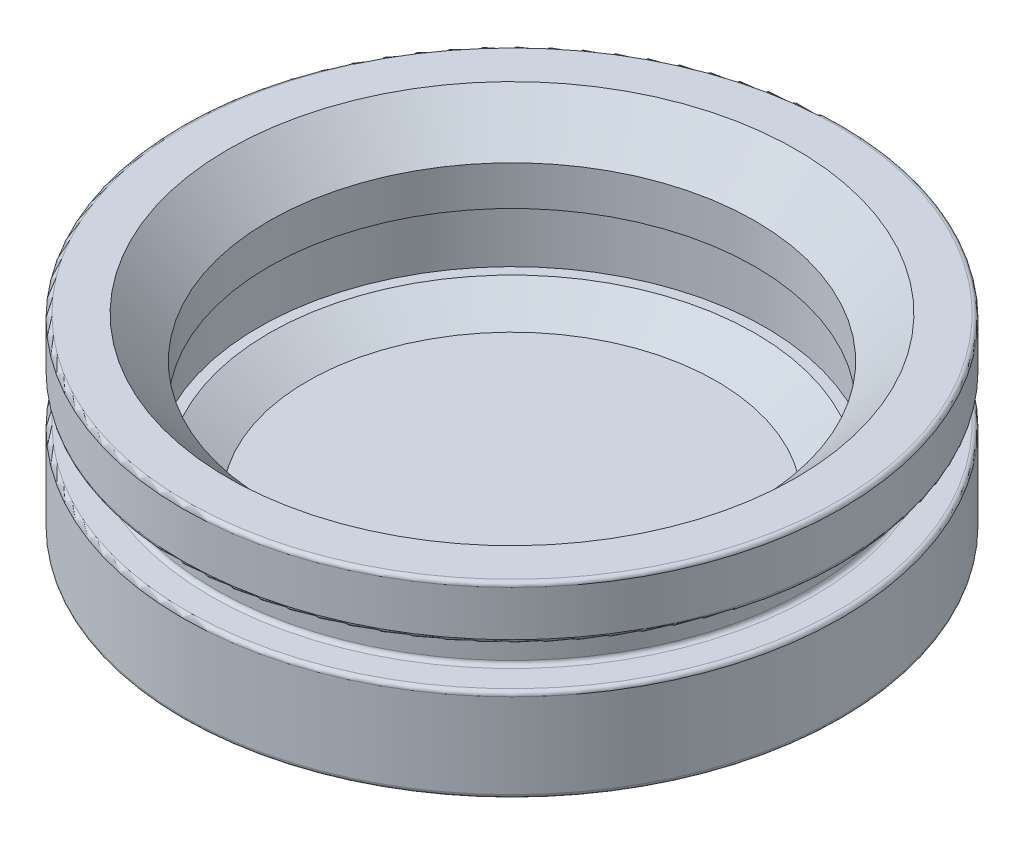
ISO-10303-21;
HEADER;
FILE_DESCRIPTION(('STEP AP214'),'2;1');
FILE_NAME('part.step','',(''),(''),'','','');
FILE_SCHEMA(('AUTOMOTIVE_DESIGN { 1 0 10303 214 1 1 1 1 }'));
ENDSEC;
DATA;
#1=APPLICATION_CONTEXT('core data for automotive mechanical design processes');
#2=APPLICATION_PROTOCOL_DEFINITION('international standard','automotive_design',2000,#1);
#3=PRODUCT_CONTEXT('',#1,'mechanical');
#4=PRODUCT('Part','Part','',(#3));
#5=PRODUCT_RELATED_PRODUCT_CATEGORY('part','',(#4));
#6=PRODUCT_DEFINITION_FORMATION('','',#4);
#7=PRODUCT_DEFINITION_CONTEXT('part definition',#1,'design');
#8=PRODUCT_DEFINITION('design','',#6,#7);
#9=PRODUCT_DEFINITION_SHAPE('','',#8);
#10=(LENGTH_UNIT() NAMED_UNIT(*) SI_UNIT(.MILLI.,.METRE.));
#11=(NAMED_UNIT(*) PLANE_ANGLE_UNIT() SI_UNIT($,.RADIAN.));
#12=(NAMED_UNIT(*) SI_UNIT($,.STERADIAN.) SOLID_ANGLE_UNIT());
#13=UNCERTAINTY_MEASURE_WITH_UNIT(LENGTH_MEASURE(1.E-05),#10,'distance_accuracy_value','');
#14=(GEOMETRIC_REPRESENTATION_CONTEXT(3) GLOBAL_UNCERTAINTY_ASSIGNED_CONTEXT((#13)) GLOBAL_UNIT_ASSIGNED_CONTEXT((#10,
#11,#12)) REPRESENTATION_CONTEXT('',''));
#15=CARTESIAN_POINT('',(0.,0.,0.));
#16=DIRECTION('',(0.,0.,1.));
#17=DIRECTION('',(1.,0.,0.));
#18=AXIS2_PLACEMENT_3D('',#15,#16,#17);
#19=CARTESIAN_POINT('',(0.,0.,0.));
#20=DIRECTION('',(0.,1.,0.));
#21=DIRECTION('',(-1.,0.,0.));
#22=AXIS2_PLACEMENT_3D('',#19,#20,#21);
#23=CONICAL_SURFACE('',#22,0.,1.16066898625341);
#24=CARTESIAN_POINT('',(0.,4.38419052876068,0.));
#25=DIRECTION('',(0.,-1.,0.));
#26=DIRECTION('',(1.,0.,0.));
#27=AXIS2_PLACEMENT_3D('',#24,#25,#26);
#28=CIRCLE('',#27,10.0836382161497);
#29=CARTESIAN_POINT('',(10.0836382161496,4.38419052876072,0.));
#30=VERTEX_POINT('',#29);
#31=EDGE_CURVE('E11',#30,#30,#28,.T.);
#32=ORIENTED_EDGE('',*,*,#31,.T.);
#33=EDGE_LOOP('',(#32));
#34=FACE_BOUND('',#33,.T.);
#35=CARTESIAN_POINT('',(0.,0.,0.));
#36=VERTEX_POINT('',#35);
#37=VERTEX_LOOP('',#36);
#38=FACE_BOUND('',#37,.T.);
#39=ADVANCED_FACE('F36',(#34,#38),#23,.T.);
#40=CARTESIAN_POINT('',(0.,0.,0.));
#41=DIRECTION('',(0.,-1.,0.));
#42=DIRECTION('',(1.,0.,0.));
#43=AXIS2_PLACEMENT_3D('',#40,#41,#42);
#44=CYLINDRICAL_SURFACE('',#43,10.16);
#45=CARTESIAN_POINT('',(0.,7.11199999999997,0.));
#46=DIRECTION('',(0.,1.,0.));
#47=DIRECTION('',(-1.,0.,0.));
#48=AXIS2_PLACEMENT_3D('',#45,#46,#47);
#49=CIRCLE('',#48,10.16);
#50=CARTESIAN_POINT('',(-10.16,7.11199999999993,0.));
#51=VERTEX_POINT('',#50);
#52=EDGE_CURVE('E93',#51,#51,#49,.F.);
#53=ORIENTED_EDGE('',*,*,#52,.T.);
#54=EDGE_LOOP('',(#53));
#55=FACE_BOUND('',#54,.T.);
#56=CARTESIAN_POINT('',(0.,4.50065842590484,0.));
#57=DIRECTION('',(0.,1.,0.));
#58=DIRECTION('',(-1.,0.,0.));
#59=AXIS2_PLACEMENT_3D('',#56,#57,#58);
#60=CIRCLE('',#59,10.16);
#61=CARTESIAN_POINT('',(-10.16,4.50065842590481,0.));
#62=VERTEX_POINT('',#61);
#63=EDGE_CURVE('E98',#62,#62,#60,.T.);
#64=ORIENTED_EDGE('',*,*,#63,.T.);
#65=EDGE_LOOP('',(#64));
#66=FACE_BOUND('',#65,.T.);
#67=ADVANCED_FACE('F47',(#55,#66),#44,.T.);
#68=CARTESIAN_POINT('',(9.144,7.239,0.));
#69=DIRECTION('',(0.,1.,0.));
#70=DIRECTION('',(-1.,0.,0.));
#71=AXIS2_PLACEMENT_3D('',#68,#69,#70);
#72=PLANE('',#71);
#73=CARTESIAN_POINT('',(0.,7.23899999999997,0.));
#74=DIRECTION('',(0.,1.,0.));
#75=DIRECTION('',(-1.,0.,0.));
#76=AXIS2_PLACEMENT_3D('',#73,#74,#75);
#77=CIRCLE('',#76,9.27100000000003);
#78=CARTESIAN_POINT('',(-9.27100000000006,7.23899999999994,0.));
#79=VERTEX_POINT('',#78);
#80=EDGE_CURVE('E125',#79,#79,#77,.F.);
#81=ORIENTED_EDGE('',*,*,#80,.T.);
#82=EDGE_LOOP('',(#81));
#83=FACE_BOUND('',#82,.T.);
#84=CARTESIAN_POINT('',(0.,7.23899999999997,0.));
#85=DIRECTION('',(0.,1.,0.));
#86=DIRECTION('',(-1.,0.,0.));
#87=AXIS2_PLACEMENT_3D('',#84,#85,#86);
#88=CIRCLE('',#87,10.033);
#89=CARTESIAN_POINT('',(-10.033,7.23899999999993,0.));
#90=VERTEX_POINT('',#89);
#91=EDGE_CURVE('E116',#90,#90,#88,.T.);
#92=ORIENTED_EDGE('',*,*,#91,.T.);
#93=EDGE_LOOP('',(#92));
#94=FACE_BOUND('',#93,.T.);
#95=ADVANCED_FACE('F53',(#83,#94),#72,.T.);
#96=CARTESIAN_POINT('',(0.,0.,0.));
#97=DIRECTION('',(0.,-1.,0.));
#98=DIRECTION('',(1.,0.,0.));
#99=AXIS2_PLACEMENT_3D('',#96,#97,#98);
#100=CYLINDRICAL_SURFACE('',#99,9.14400000000003);
#101=CARTESIAN_POINT('',(0.,7.36599999999997,0.));
#102=DIRECTION('',(0.,1.,0.));
#103=DIRECTION('',(-1.,0.,0.));
#104=AXIS2_PLACEMENT_3D('',#101,#102,#103);
#105=CIRCLE('',#104,9.14400000000003);
#106=CARTESIAN_POINT('',(-9.14400000000006,7.36599999999994,0.));
#107=VERTEX_POINT('',#106);
#108=EDGE_CURVE('E131',#107,#107,#105,.T.);
#109=ORIENTED_EDGE('',*,*,#108,.T.);
#110=EDGE_LOOP('',(#109));
#111=FACE_BOUND('',#110,.T.);
#112=CARTESIAN_POINT('',(0.,8.38199999999997,0.));
#113=DIRECTION('',(0.,-1.,0.));
#114=DIRECTION('',(1.,0.,0.));
#115=AXIS2_PLACEMENT_3D('',#112,#113,#114);
#116=CIRCLE('',#115,9.14400000000003);
#117=CARTESIAN_POINT('',(9.144,8.382,0.));
#118=VERTEX_POINT('',#117);
#119=EDGE_CURVE('E128',#118,#118,#116,.T.);
#120=ORIENTED_EDGE('',*,*,#119,.T.);
#121=EDGE_LOOP('',(#120));
#122=FACE_BOUND('',#121,.T.);
#123=ADVANCED_FACE('F151',(#111,#122),#100,.T.);
#124=CARTESIAN_POINT('',(10.16,8.509,0.));
#125=DIRECTION('',(0.,-1.,0.));
#126=DIRECTION('',(1.,0.,0.));
#127=AXIS2_PLACEMENT_3D('',#124,#125,#126);
#128=PLANE('',#127);
#129=CARTESIAN_POINT('',(0.,8.50899999999997,0.));
#130=DIRECTION('',(0.,-1.,0.));
#131=DIRECTION('',(1.,0.,0.));
#132=AXIS2_PLACEMENT_3D('',#129,#130,#131);
#133=CIRCLE('',#132,9.27100000000003);
#134=CARTESIAN_POINT('',(9.271,8.509,0.));
#135=VERTEX_POINT('',#134);
#136=EDGE_CURVE('E137',#135,#135,#133,.F.);
#137=ORIENTED_EDGE('',*,*,#136,.T.);
#138=EDGE_LOOP('',(#137));
#139=FACE_BOUND('',#138,.T.);
#140=CARTESIAN_POINT('',(0.,8.50899999999997,0.));
#141=DIRECTION('',(0.,-1.,0.));
#142=DIRECTION('',(1.,0.,0.));
#143=AXIS2_PLACEMENT_3D('',#140,#141,#142);
#144=CIRCLE('',#143,10.033);
#145=CARTESIAN_POINT('',(10.033,8.509,0.));
#146=VERTEX_POINT('',#145);
#147=EDGE_CURVE('E134',#146,#146,#144,.T.);
#148=ORIENTED_EDGE('',*,*,#147,.T.);
#149=EDGE_LOOP('',(#148));
#150=FACE_BOUND('',#149,.T.);
#151=ADVANCED_FACE('F146',(#139,#150),#128,.T.);
#152=CARTESIAN_POINT('',(0.,0.,0.));
#153=DIRECTION('',(0.,-1.,0.));
#154=DIRECTION('',(1.,0.,0.));
#155=AXIS2_PLACEMENT_3D('',#152,#153,#154);
#156=CYLINDRICAL_SURFACE('',#155,10.16);
#157=CARTESIAN_POINT('',(0.,8.63599999999997,0.));
#158=DIRECTION('',(0.,-1.,0.));
#159=DIRECTION('',(1.,0.,0.));
#160=AXIS2_PLACEMENT_3D('',#157,#158,#159);
#161=CIRCLE('',#160,10.16);
#162=CARTESIAN_POINT('',(10.16,8.636,0.));
#163=VERTEX_POINT('',#162);
#164=EDGE_CURVE('E92',#163,#163,#161,.F.);
#165=ORIENTED_EDGE('',*,*,#164,.T.);
#166=EDGE_LOOP('',(#165));
#167=FACE_BOUND('',#166,.T.);
#168=CARTESIAN_POINT('',(0.,10.033,0.));
#169=DIRECTION('',(0.,1.,0.));
#170=DIRECTION('',(-1.,0.,0.));
#171=AXIS2_PLACEMENT_3D('',#168,#169,#170);
#172=CIRCLE('',#171,10.16);
#173=CARTESIAN_POINT('',(-10.1600000000001,10.0329999999999,0.));
#174=VERTEX_POINT('',#173);
#175=EDGE_CURVE('E90',#174,#174,#172,.F.);
#176=ORIENTED_EDGE('',*,*,#175,.T.);
#177=EDGE_LOOP('',(#176));
#178=FACE_BOUND('',#177,.T.);
#179=ADVANCED_FACE('F106',(#167,#178),#156,.T.);
#180=CARTESIAN_POINT('',(10.16,10.16,0.));
#181=DIRECTION('',(0.,1.,0.));
#182=DIRECTION('',(-1.,0.,0.));
#183=AXIS2_PLACEMENT_3D('',#180,#181,#182);
#184=PLANE('',#183);
#185=CARTESIAN_POINT('',(0.,10.16,0.));
#186=DIRECTION('',(0.,1.,0.));
#187=DIRECTION('',(-1.,0.,0.));
#188=AXIS2_PLACEMENT_3D('',#185,#186,#187);
#189=CIRCLE('',#188,10.033);
#190=CARTESIAN_POINT('',(-10.0330000000001,10.1599999999999,0.));
#191=VERTEX_POINT('',#190);
#192=EDGE_CURVE('E43',#191,#191,#189,.T.);
#193=ORIENTED_EDGE('',*,*,#192,.T.);
#194=EDGE_LOOP('',(#193));
#195=FACE_BOUND('',#194,.T.);
#196=CARTESIAN_POINT('',(0.,10.16,0.));
#197=DIRECTION('',(0.,1.,0.));
#198=DIRECTION('',(-1.,0.,0.));
#199=AXIS2_PLACEMENT_3D('',#196,#197,#198);
#200=CIRCLE('',#199,8.76300000000003);
#201=CARTESIAN_POINT('',(-8.76300000000007,10.1599999999999,0.));
#202=VERTEX_POINT('',#201);
#203=EDGE_CURVE('E110',#202,#202,#200,.F.);
#204=ORIENTED_EDGE('',*,*,#203,.T.);
#205=EDGE_LOOP('',(#204));
#206=FACE_BOUND('',#205,.T.);
#207=ADVANCED_FACE('F102',(#195,#206),#184,.T.);
#208=CARTESIAN_POINT('',(0.,0.,0.));
#209=DIRECTION('',(0.,-1.,0.));
#210=DIRECTION('',(1.,0.,0.));
#211=AXIS2_PLACEMENT_3D('',#208,#209,#210);
#212=CYLINDRICAL_SURFACE('',#211,7.49300000000003);
#213=CARTESIAN_POINT('',(0.,8.88999999999997,0.));
#214=DIRECTION('',(0.,1.,0.));
#215=DIRECTION('',(-1.,0.,0.));
#216=AXIS2_PLACEMENT_3D('',#213,#214,#215);
#217=CIRCLE('',#216,7.49300000000003);
#218=CARTESIAN_POINT('',(-7.49300000000006,8.88999999999995,0.));
#219=VERTEX_POINT('',#218);
#220=EDGE_CURVE('E112',#219,#219,#217,.T.);
#221=ORIENTED_EDGE('',*,*,#220,.T.);
#222=EDGE_LOOP('',(#221));
#223=FACE_BOUND('',#222,.T.);
#224=CARTESIAN_POINT('',(0.,7.67079999999998,0.));
#225=DIRECTION('',(0.,-1.,0.));
#226=DIRECTION('',(1.,0.,0.));
#227=AXIS2_PLACEMENT_3D('',#224,#225,#226);
#228=CIRCLE('',#227,7.49300000000003);
#229=CARTESIAN_POINT('',(7.493,7.6708,0.));
#230=VERTEX_POINT('',#229);
#231=EDGE_CURVE('E113',#230,#230,#228,.T.);
#232=ORIENTED_EDGE('',*,*,#231,.T.);
#233=EDGE_LOOP('',(#232));
#234=FACE_BOUND('',#233,.T.);
#235=ADVANCED_FACE('F105',(#223,#234),#212,.F.);
#236=CARTESIAN_POINT('',(7.493,7.6708,0.));
#237=DIRECTION('',(0.,-1.,0.));
#238=DIRECTION('',(1.,0.,0.));
#239=AXIS2_PLACEMENT_3D('',#236,#237,#238);
#240=PLANE('',#239);
#241=CARTESIAN_POINT('',(0.,7.67079999999997,0.));
#242=DIRECTION('',(0.,-1.,0.));
#243=DIRECTION('',(1.,0.,0.));
#244=AXIS2_PLACEMENT_3D('',#241,#242,#243);
#245=CIRCLE('',#244,7.81050000000003);
#246=CARTESIAN_POINT('',(7.8105,7.6708,0.));
#247=VERTEX_POINT('',#246);
#248=EDGE_CURVE('E119',#247,#247,#245,.T.);
#249=ORIENTED_EDGE('',*,*,#248,.T.);
#250=EDGE_LOOP('',(#249));
#251=FACE_BOUND('',#250,.T.);
#252=ORIENTED_EDGE('',*,*,#231,.F.);
#253=EDGE_LOOP('',(#252));
#254=FACE_BOUND('',#253,.T.);
#255=ADVANCED_FACE('F167',(#251,#254),#240,.T.);
#256=CARTESIAN_POINT('',(0.,0.,0.));
#257=DIRECTION('',(0.,-1.,0.));
#258=DIRECTION('',(1.,0.,0.));
#259=AXIS2_PLACEMENT_3D('',#256,#257,#258);
#260=CYLINDRICAL_SURFACE('',#259,7.81050000000002);
#261=CARTESIAN_POINT('',(0.,5.89279999999998,0.));
#262=DIRECTION('',(0.,-1.,0.));
#263=DIRECTION('',(1.,0.,0.));
#264=AXIS2_PLACEMENT_3D('',#261,#262,#263);
#265=CIRCLE('',#264,7.81050000000002);
#266=CARTESIAN_POINT('',(7.8105,5.8928,0.));
#267=VERTEX_POINT('',#266);
#268=EDGE_CURVE('E194',#267,#267,#265,.T.);
#269=ORIENTED_EDGE('',*,*,#268,.T.);
#270=EDGE_LOOP('',(#269));
#271=FACE_BOUND('',#270,.T.);
#272=ORIENTED_EDGE('',*,*,#248,.F.);
#273=EDGE_LOOP('',(#272));
#274=FACE_BOUND('',#273,.T.);
#275=ADVANCED_FACE('F171',(#271,#274),#260,.F.);
#276=CARTESIAN_POINT('',(7.8105,5.8928,0.));
#277=DIRECTION('',(0.,1.,0.));
#278=DIRECTION('',(-1.,0.,0.));
#279=AXIS2_PLACEMENT_3D('',#276,#277,#278);
#280=PLANE('',#279);
#281=CARTESIAN_POINT('',(0.,5.89279999999998,0.));
#282=DIRECTION('',(0.,-1.,0.));
#283=DIRECTION('',(1.,0.,0.));
#284=AXIS2_PLACEMENT_3D('',#281,#282,#283);
#285=CIRCLE('',#284,7.49300000000002);
#286=CARTESIAN_POINT('',(7.493,5.8928,0.));
#287=VERTEX_POINT('',#286);
#288=EDGE_CURVE('E191',#287,#287,#285,.T.);
#289=ORIENTED_EDGE('',*,*,#288,.T.);
#290=EDGE_LOOP('',(#289));
#291=FACE_BOUND('',#290,.T.);
#292=ORIENTED_EDGE('',*,*,#268,.F.);
#293=EDGE_LOOP('',(#292));
#294=FACE_BOUND('',#293,.T.);
#295=ADVANCED_FACE('F175',(#291,#294),#280,.T.);
#296=CARTESIAN_POINT('',(0.,5.89279999999998,0.));
#297=DIRECTION('',(0.,1.,0.));
#298=DIRECTION('',(-1.,0.,0.));
#299=AXIS2_PLACEMENT_3D('',#296,#297,#298);
#300=CONICAL_SURFACE('',#299,7.49300000000002,1.0471975511966);
#301=CARTESIAN_POINT('',(0.,5.20699999999998,0.));
#302=DIRECTION('',(0.,-1.,0.));
#303=DIRECTION('',(1.,0.,0.));
#304=AXIS2_PLACEMENT_3D('',#301,#302,#303);
#305=CIRCLE('',#304,6.30515955616929);
#306=CARTESIAN_POINT('',(6.30515955616927,5.207,0.));
#307=VERTEX_POINT('',#306);
#308=EDGE_CURVE('E190',#307,#307,#305,.T.);
#309=ORIENTED_EDGE('',*,*,#308,.T.);
#310=EDGE_LOOP('',(#309));
#311=FACE_BOUND('',#310,.T.);
#312=ORIENTED_EDGE('',*,*,#288,.F.);
#313=EDGE_LOOP('',(#312));
#314=FACE_BOUND('',#313,.T.);
#315=ADVANCED_FACE('F179',(#311,#314),#300,.F.);
#316=CARTESIAN_POINT('',(6.30515955616927,5.20700000000001,0.));
#317=DIRECTION('',(0.,1.,0.));
#318=DIRECTION('',(-1.,0.,0.));
#319=AXIS2_PLACEMENT_3D('',#316,#317,#318);
#320=PLANE('',#319);
#321=ORIENTED_EDGE('',*,*,#308,.F.);
#322=EDGE_LOOP('',(#321));
#323=FACE_BOUND('',#322,.T.);
#324=ADVANCED_FACE('F62',(#323),#320,.T.);
#325=CARTESIAN_POINT('',(0.,10.16,0.));
#326=DIRECTION('',(0.,1.,0.));
#327=DIRECTION('',(-1.,0.,0.));
#328=AXIS2_PLACEMENT_3D('',#325,#326,#327);
#329=CONICAL_SURFACE('',#328,8.76300000000003,0.785398163397448);
#330=ORIENTED_EDGE('',*,*,#220,.F.);
#331=EDGE_LOOP('',(#330));
#332=FACE_BOUND('',#331,.T.);
#333=ORIENTED_EDGE('',*,*,#203,.F.);
#334=EDGE_LOOP('',(#333));
#335=FACE_BOUND('',#334,.T.);
#336=ADVANCED_FACE('F58',(#332,#335),#329,.F.);
#337=CARTESIAN_POINT('',(0.,7.36599999999997,0.));
#338=DIRECTION('',(0.,1.,0.));
#339=DIRECTION('',(-1.,0.,0.));
#340=AXIS2_PLACEMENT_3D('',#337,#338,#339);
#341=TOROIDAL_SURFACE('',#340,9.27100000000003,0.127);
#342=ORIENTED_EDGE('',*,*,#108,.F.);
#343=EDGE_LOOP('',(#342));
#344=FACE_BOUND('',#343,.T.);
#345=ORIENTED_EDGE('',*,*,#80,.F.);
#346=EDGE_LOOP('',(#345));
#347=FACE_BOUND('',#346,.T.);
#348=ADVANCED_FACE('F61',(#344,#347),#341,.F.);
#349=CARTESIAN_POINT('',(0.,8.38199999999997,0.));
#350=DIRECTION('',(0.,-1.,0.));
#351=DIRECTION('',(1.,0.,0.));
#352=AXIS2_PLACEMENT_3D('',#349,#350,#351);
#353=TOROIDAL_SURFACE('',#352,9.27100000000003,0.127);
#354=ORIENTED_EDGE('',*,*,#136,.F.);
#355=EDGE_LOOP('',(#354));
#356=FACE_BOUND('',#355,.T.);
#357=ORIENTED_EDGE('',*,*,#119,.F.);
#358=EDGE_LOOP('',(#357));
#359=FACE_BOUND('',#358,.T.);
#360=ADVANCED_FACE('F66',(#356,#359),#353,.F.);
#361=CARTESIAN_POINT('',(0.,7.11199999999997,0.));
#362=DIRECTION('',(0.,1.,0.));
#363=DIRECTION('',(-1.,0.,0.));
#364=AXIS2_PLACEMENT_3D('',#361,#362,#363);
#365=TOROIDAL_SURFACE('',#364,10.033,0.127);
#366=ORIENTED_EDGE('',*,*,#91,.F.);
#367=EDGE_LOOP('',(#366));
#368=FACE_BOUND('',#367,.T.);
#369=ORIENTED_EDGE('',*,*,#52,.F.);
#370=EDGE_LOOP('',(#369));
#371=FACE_BOUND('',#370,.T.);
#372=ADVANCED_FACE('F70',(#368,#371),#365,.T.);
#373=CARTESIAN_POINT('',(0.,8.63599999999997,0.));
#374=DIRECTION('',(0.,-1.,0.));
#375=DIRECTION('',(1.,0.,0.));
#376=AXIS2_PLACEMENT_3D('',#373,#374,#375);
#377=TOROIDAL_SURFACE('',#376,10.033,0.127);
#378=ORIENTED_EDGE('',*,*,#164,.F.);
#379=EDGE_LOOP('',(#378));
#380=FACE_BOUND('',#379,.T.);
#381=ORIENTED_EDGE('',*,*,#147,.F.);
#382=EDGE_LOOP('',(#381));
#383=FACE_BOUND('',#382,.T.);
#384=ADVANCED_FACE('F74',(#380,#383),#377,.T.);
#385=CARTESIAN_POINT('',(0.,10.033,0.));
#386=DIRECTION('',(0.,1.,0.));
#387=DIRECTION('',(-1.,0.,0.));
#388=AXIS2_PLACEMENT_3D('',#385,#386,#387);
#389=TOROIDAL_SURFACE('',#388,10.033,0.127);
#390=ORIENTED_EDGE('',*,*,#192,.F.);
#391=EDGE_LOOP('',(#390));
#392=FACE_BOUND('',#391,.T.);
#393=ORIENTED_EDGE('',*,*,#175,.F.);
#394=EDGE_LOOP('',(#393));
#395=FACE_BOUND('',#394,.T.);
#396=ADVANCED_FACE('F77',(#392,#395),#389,.T.);
#397=CARTESIAN_POINT('',(0.,4.50065842590484,0.));
#398=DIRECTION('',(0.,1.,0.));
#399=DIRECTION('',(-1.,0.,0.));
#400=AXIS2_PLACEMENT_3D('',#397,#398,#399);
#401=TOROIDAL_SURFACE('',#400,10.033,0.127);
#402=ORIENTED_EDGE('',*,*,#63,.F.);
#403=EDGE_LOOP('',(#402));
#404=FACE_BOUND('',#403,.T.);
#405=ORIENTED_EDGE('',*,*,#31,.F.);
#406=EDGE_LOOP('',(#405));
#407=FACE_BOUND('',#406,.T.);
#408=ADVANCED_FACE('F38',(#404,#407),#401,.T.);
#409=CLOSED_SHELL('',(#39,#67,#95,#123,#151,#179,#207,#235,#255,#275,#295,#315,#324,#336,#348,
#360,#372,#384,#396,#408));
#410=MANIFOLD_SOLID_BREP('B2',#409);
#411=ADVANCED_BREP_SHAPE_REPRESENTATION('',(#18,#410),#14);
#412=SHAPE_DEFINITION_REPRESENTATION(#9,#411);
ENDSEC;
END-ISO-10303-21;
